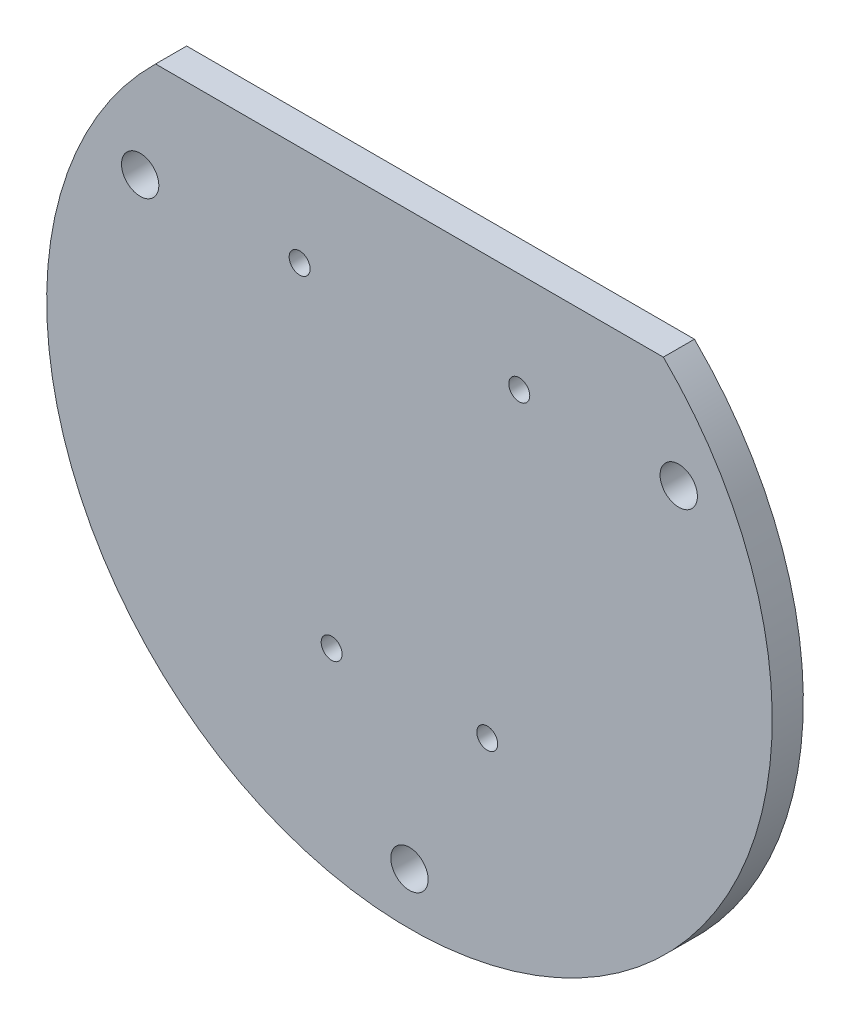
ISO-10303-21;
HEADER;
FILE_DESCRIPTION(('STEP AP214'),'2;1');
FILE_NAME('part.step','',(''),(''),'','','');
FILE_SCHEMA(('AUTOMOTIVE_DESIGN { 1 0 10303 214 1 1 1 1 }'));
ENDSEC;
DATA;
#1=APPLICATION_CONTEXT('core data for automotive mechanical design processes');
#2=APPLICATION_PROTOCOL_DEFINITION('international standard','automotive_design',2000,#1);
#3=PRODUCT_CONTEXT('',#1,'mechanical');
#4=PRODUCT('Part','Part','',(#3));
#5=PRODUCT_RELATED_PRODUCT_CATEGORY('part','',(#4));
#6=PRODUCT_DEFINITION_FORMATION('','',#4);
#7=PRODUCT_DEFINITION_CONTEXT('part definition',#1,'design');
#8=PRODUCT_DEFINITION('design','',#6,#7);
#9=PRODUCT_DEFINITION_SHAPE('','',#8);
#10=(LENGTH_UNIT() NAMED_UNIT(*) SI_UNIT(.MILLI.,.METRE.));
#11=(NAMED_UNIT(*) PLANE_ANGLE_UNIT() SI_UNIT($,.RADIAN.));
#12=(NAMED_UNIT(*) SI_UNIT($,.STERADIAN.) SOLID_ANGLE_UNIT());
#13=UNCERTAINTY_MEASURE_WITH_UNIT(LENGTH_MEASURE(1.E-05),#10,'distance_accuracy_value','');
#14=(GEOMETRIC_REPRESENTATION_CONTEXT(3) GLOBAL_UNCERTAINTY_ASSIGNED_CONTEXT((#13)) GLOBAL_UNIT_ASSIGNED_CONTEXT((#10,
#11,#12)) REPRESENTATION_CONTEXT('',''));
#15=CARTESIAN_POINT('',(0.,0.,0.));
#16=DIRECTION('',(0.,0.,1.));
#17=DIRECTION('',(1.,0.,0.));
#18=AXIS2_PLACEMENT_3D('',#15,#16,#17);
#19=CARTESIAN_POINT('',(0.,74.8590256141216,0.));
#20=DIRECTION('',(0.,0.,1.));
#21=DIRECTION('',(1.,0.,0.));
#22=AXIS2_PLACEMENT_3D('',#19,#20,#21);
#23=PLANE('',#22);
#24=CARTESIAN_POINT('',(0.,-73.3734122634726,0.));
#25=DIRECTION('',(0.,0.,1.));
#26=DIRECTION('',(1.,0.,0.));
#27=AXIS2_PLACEMENT_3D('',#24,#25,#26);
#28=CIRCLE('',#27,9.);
#29=CARTESIAN_POINT('',(-9.,-73.3734122634726,0.));
#30=VERTEX_POINT('',#29);
#31=EDGE_CURVE('E136',#30,#30,#28,.T.);
#32=ORIENTED_EDGE('',*,*,#31,.T.);
#33=EDGE_LOOP('',(#32));
#34=FACE_BOUND('',#33,.T.);
#35=CARTESIAN_POINT('',(129.903810567666,151.626587736527,0.));
#36=DIRECTION('',(0.,0.,1.));
#37=DIRECTION('',(-0.5,0.866025403784439,0.));
#38=AXIS2_PLACEMENT_3D('',#35,#36,#37);
#39=CIRCLE('',#38,9.);
#40=CARTESIAN_POINT('',(134.403810567666,143.832359102467,0.));
#41=VERTEX_POINT('',#40);
#42=EDGE_CURVE('E177',#41,#41,#39,.T.);
#43=ORIENTED_EDGE('',*,*,#42,.T.);
#44=EDGE_LOOP('',(#43));
#45=FACE_BOUND('',#44,.T.);
#46=CARTESIAN_POINT('',(-129.903810567666,151.626587736527,0.));
#47=DIRECTION('',(0.,0.,1.));
#48=DIRECTION('',(-0.5,-0.866025403784439,0.));
#49=AXIS2_PLACEMENT_3D('',#46,#47,#48);
#50=CIRCLE('',#49,9.);
#51=CARTESIAN_POINT('',(-125.403810567666,159.420816370587,0.));
#52=VERTEX_POINT('',#51);
#53=EDGE_CURVE('E135',#52,#52,#50,.T.);
#54=ORIENTED_EDGE('',*,*,#53,.T.);
#55=EDGE_LOOP('',(#54));
#56=FACE_BOUND('',#55,.T.);
#57=CARTESIAN_POINT('',(37.5349950094086,-3.77475828372553E-13,0.));
#58=DIRECTION('',(0.,0.,1.));
#59=DIRECTION('',(-1.,0.,0.));
#60=AXIS2_PLACEMENT_3D('',#57,#58,#59);
#61=CIRCLE('',#60,5.053);
#62=CARTESIAN_POINT('',(42.5879950094086,-3.78094642400162E-13,0.));
#63=VERTEX_POINT('',#62);
#64=EDGE_CURVE('E110',#63,#63,#61,.T.);
#65=ORIENTED_EDGE('',*,*,#64,.T.);
#66=EDGE_LOOP('',(#65));
#67=FACE_BOUND('',#66,.T.);
#68=CARTESIAN_POINT('',(-52.97728135,153.253175473055,0.));
#69=DIRECTION('',(0.,0.,1.));
#70=DIRECTION('',(-1.,0.,0.));
#71=AXIS2_PLACEMENT_3D('',#68,#69,#70);
#72=CIRCLE('',#71,5.053);
#73=CARTESIAN_POINT('',(-47.92428135,153.253175473055,0.));
#74=VERTEX_POINT('',#73);
#75=EDGE_CURVE('E159',#74,#74,#72,.T.);
#76=ORIENTED_EDGE('',*,*,#75,.T.);
#77=EDGE_LOOP('',(#76));
#78=FACE_BOUND('',#77,.T.);
#79=CARTESIAN_POINT('',(52.97728135,153.253175473055,0.));
#80=DIRECTION('',(0.,0.,1.));
#81=DIRECTION('',(-1.,0.,0.));
#82=AXIS2_PLACEMENT_3D('',#79,#80,#81);
#83=CIRCLE('',#82,5.053);
#84=CARTESIAN_POINT('',(58.03028135,153.253175473055,0.));
#85=VERTEX_POINT('',#84);
#86=EDGE_CURVE('E141',#85,#85,#83,.T.);
#87=ORIENTED_EDGE('',*,*,#86,.T.);
#88=EDGE_LOOP('',(#87));
#89=FACE_BOUND('',#88,.T.);
#90=CARTESIAN_POINT('',(-37.5349950094086,-3.86912724081867E-13,0.));
#91=DIRECTION('',(0.,0.,1.));
#92=DIRECTION('',(-1.,0.,0.));
#93=AXIS2_PLACEMENT_3D('',#90,#91,#92);
#94=CIRCLE('',#93,5.053);
#95=CARTESIAN_POINT('',(-32.4819950094086,-3.87531538109476E-13,0.));
#96=VERTEX_POINT('',#95);
#97=EDGE_CURVE('E202',#96,#96,#94,.T.);
#98=ORIENTED_EDGE('',*,*,#97,.T.);
#99=EDGE_LOOP('',(#98));
#100=FACE_BOUND('',#99,.T.);
#101=CARTESIAN_POINT('',(0.,76.6265877365274,0.));
#102=DIRECTION('',(0.,0.,1.));
#103=DIRECTION('',(-0.699854212223765,0.714285714285715,0.));
#104=AXIS2_PLACEMENT_3D('',#101,#102,#103);
#105=CIRCLE('',#104,175.);
#106=CARTESIAN_POINT('',(-122.474487139159,201.626587736527,0.));
#107=VERTEX_POINT('',#106);
#108=CARTESIAN_POINT('',(122.474487139159,201.626587736527,0.));
#109=VERTEX_POINT('',#108);
#110=EDGE_CURVE('E28',#107,#109,#105,.T.);
#111=ORIENTED_EDGE('',*,*,#110,.F.);
#112=DIRECTION('',(-1.,0.,0.));
#113=VECTOR('',#112,1.);
#114=CARTESIAN_POINT('',(122.474487139159,201.626587736527,0.));
#115=LINE('',#114,#113);
#116=EDGE_CURVE('E139',#109,#107,#115,.T.);
#117=ORIENTED_EDGE('',*,*,#116,.F.);
#118=EDGE_LOOP('',(#111,#117));
#119=FACE_BOUND('',#118,.T.);
#120=ADVANCED_FACE('F17',(#34,#45,#56,#67,#78,#89,#100,#119),#23,.F.);
#121=CARTESIAN_POINT('',(0.,74.8590256141216,15.));
#122=DIRECTION('',(0.,0.,1.));
#123=DIRECTION('',(1.,0.,0.));
#124=AXIS2_PLACEMENT_3D('',#121,#122,#123);
#125=PLANE('',#124);
#126=CARTESIAN_POINT('',(0.,-73.3734122634726,15.));
#127=DIRECTION('',(0.,0.,-1.));
#128=DIRECTION('',(1.,0.,0.));
#129=AXIS2_PLACEMENT_3D('',#126,#127,#128);
#130=CIRCLE('',#129,9.);
#131=CARTESIAN_POINT('',(-9.,-73.3734122634726,15.));
#132=VERTEX_POINT('',#131);
#133=EDGE_CURVE('E180',#132,#132,#130,.T.);
#134=ORIENTED_EDGE('',*,*,#133,.T.);
#135=EDGE_LOOP('',(#134));
#136=FACE_BOUND('',#135,.T.);
#137=CARTESIAN_POINT('',(129.903810567666,151.626587736527,15.));
#138=DIRECTION('',(0.,0.,-1.));
#139=DIRECTION('',(-0.5,0.866025403784439,0.));
#140=AXIS2_PLACEMENT_3D('',#137,#138,#139);
#141=CIRCLE('',#140,9.);
#142=CARTESIAN_POINT('',(134.403810567666,143.832359102467,15.));
#143=VERTEX_POINT('',#142);
#144=EDGE_CURVE('E130',#143,#143,#141,.T.);
#145=ORIENTED_EDGE('',*,*,#144,.T.);
#146=EDGE_LOOP('',(#145));
#147=FACE_BOUND('',#146,.T.);
#148=CARTESIAN_POINT('',(-129.903810567666,151.626587736527,15.));
#149=DIRECTION('',(0.,0.,-1.));
#150=DIRECTION('',(-0.5,-0.866025403784439,0.));
#151=AXIS2_PLACEMENT_3D('',#148,#149,#150);
#152=CIRCLE('',#151,9.);
#153=CARTESIAN_POINT('',(-125.403810567666,159.420816370587,15.));
#154=VERTEX_POINT('',#153);
#155=EDGE_CURVE('E181',#154,#154,#152,.T.);
#156=ORIENTED_EDGE('',*,*,#155,.T.);
#157=EDGE_LOOP('',(#156));
#158=FACE_BOUND('',#157,.T.);
#159=CARTESIAN_POINT('',(37.5349950094086,-3.77475828372553E-13,15.));
#160=DIRECTION('',(0.,0.,-1.));
#161=DIRECTION('',(-1.,0.,0.));
#162=AXIS2_PLACEMENT_3D('',#159,#160,#161);
#163=CIRCLE('',#162,5.053);
#164=CARTESIAN_POINT('',(42.5879950094086,-3.78094642400162E-13,15.));
#165=VERTEX_POINT('',#164);
#166=EDGE_CURVE('E111',#165,#165,#163,.T.);
#167=ORIENTED_EDGE('',*,*,#166,.T.);
#168=EDGE_LOOP('',(#167));
#169=FACE_BOUND('',#168,.T.);
#170=CARTESIAN_POINT('',(-52.97728135,153.253175473055,15.));
#171=DIRECTION('',(0.,0.,-1.));
#172=DIRECTION('',(-1.,0.,0.));
#173=AXIS2_PLACEMENT_3D('',#170,#171,#172);
#174=CIRCLE('',#173,5.053);
#175=CARTESIAN_POINT('',(-47.92428135,153.253175473055,15.));
#176=VERTEX_POINT('',#175);
#177=EDGE_CURVE('E117',#176,#176,#174,.T.);
#178=ORIENTED_EDGE('',*,*,#177,.T.);
#179=EDGE_LOOP('',(#178));
#180=FACE_BOUND('',#179,.T.);
#181=CARTESIAN_POINT('',(52.97728135,153.253175473055,15.));
#182=DIRECTION('',(0.,0.,-1.));
#183=DIRECTION('',(-1.,0.,0.));
#184=AXIS2_PLACEMENT_3D('',#181,#182,#183);
#185=CIRCLE('',#184,5.053);
#186=CARTESIAN_POINT('',(58.03028135,153.253175473055,15.));
#187=VERTEX_POINT('',#186);
#188=EDGE_CURVE('E150',#187,#187,#185,.T.);
#189=ORIENTED_EDGE('',*,*,#188,.T.);
#190=EDGE_LOOP('',(#189));
#191=FACE_BOUND('',#190,.T.);
#192=CARTESIAN_POINT('',(-37.5349950094086,-3.86912724081867E-13,15.));
#193=DIRECTION('',(0.,0.,-1.));
#194=DIRECTION('',(-1.,0.,0.));
#195=AXIS2_PLACEMENT_3D('',#192,#193,#194);
#196=CIRCLE('',#195,5.053);
#197=CARTESIAN_POINT('',(-32.4819950094086,-3.87531538109476E-13,15.));
#198=VERTEX_POINT('',#197);
#199=EDGE_CURVE('E146',#198,#198,#196,.T.);
#200=ORIENTED_EDGE('',*,*,#199,.T.);
#201=EDGE_LOOP('',(#200));
#202=FACE_BOUND('',#201,.T.);
#203=CARTESIAN_POINT('',(0.,76.6265877365274,15.));
#204=DIRECTION('',(0.,0.,1.));
#205=DIRECTION('',(-0.699854212223765,0.714285714285715,0.));
#206=AXIS2_PLACEMENT_3D('',#203,#204,#205);
#207=CIRCLE('',#206,175.);
#208=CARTESIAN_POINT('',(-122.474487139159,201.626587736527,15.));
#209=VERTEX_POINT('',#208);
#210=CARTESIAN_POINT('',(122.474487139159,201.626587736527,15.));
#211=VERTEX_POINT('',#210);
#212=EDGE_CURVE('E11',#209,#211,#207,.T.);
#213=ORIENTED_EDGE('',*,*,#212,.T.);
#214=DIRECTION('',(-1.,0.,0.));
#215=VECTOR('',#214,1.);
#216=CARTESIAN_POINT('',(122.474487139159,201.626587736527,15.));
#217=LINE('',#216,#215);
#218=EDGE_CURVE('E126',#211,#209,#217,.T.);
#219=ORIENTED_EDGE('',*,*,#218,.T.);
#220=EDGE_LOOP('',(#213,#219));
#221=FACE_BOUND('',#220,.T.);
#222=ADVANCED_FACE('F216',(#136,#147,#158,#169,#180,#191,#202,#221),#125,.T.);
#223=CARTESIAN_POINT('',(0.,76.6265877365274,0.));
#224=DIRECTION('',(0.,0.,1.));
#225=DIRECTION('',(0.,-1.,0.));
#226=AXIS2_PLACEMENT_3D('',#223,#224,#225);
#227=CYLINDRICAL_SURFACE('',#226,175.);
#228=ORIENTED_EDGE('',*,*,#110,.T.);
#229=DIRECTION('',(0.,0.,1.));
#230=VECTOR('',#229,1.);
#231=CARTESIAN_POINT('',(122.474487139159,201.626587736527,0.));
#232=LINE('',#231,#230);
#233=EDGE_CURVE('E129',#109,#211,#232,.T.);
#234=ORIENTED_EDGE('',*,*,#233,.T.);
#235=ORIENTED_EDGE('',*,*,#212,.F.);
#236=DIRECTION('',(0.,0.,1.));
#237=VECTOR('',#236,1.);
#238=CARTESIAN_POINT('',(-122.474487139159,201.626587736527,0.));
#239=LINE('',#238,#237);
#240=EDGE_CURVE('E21',#107,#209,#239,.T.);
#241=ORIENTED_EDGE('',*,*,#240,.F.);
#242=EDGE_LOOP('',(#228,#234,#235,#241));
#243=FACE_BOUND('',#242,.T.);
#244=ADVANCED_FACE('F218',(#243),#227,.T.);
#245=CARTESIAN_POINT('',(122.474487139159,201.626587736527,0.));
#246=DIRECTION('',(0.,1.,0.));
#247=DIRECTION('',(1.,0.,0.));
#248=AXIS2_PLACEMENT_3D('',#245,#246,#247);
#249=PLANE('',#248);
#250=ORIENTED_EDGE('',*,*,#116,.T.);
#251=ORIENTED_EDGE('',*,*,#240,.T.);
#252=ORIENTED_EDGE('',*,*,#218,.F.);
#253=ORIENTED_EDGE('',*,*,#233,.F.);
#254=EDGE_LOOP('',(#250,#251,#252,#253));
#255=FACE_BOUND('',#254,.T.);
#256=ADVANCED_FACE('F226',(#255),#249,.T.);
#257=CARTESIAN_POINT('',(0.,-73.3734122634726,-446.221205063254));
#258=DIRECTION('',(0.,0.,1.));
#259=DIRECTION('',(1.,0.,0.));
#260=AXIS2_PLACEMENT_3D('',#257,#258,#259);
#261=CYLINDRICAL_SURFACE('',#260,9.);
#262=ORIENTED_EDGE('',*,*,#133,.F.);
#263=DIRECTION('',(0.,0.,-1.));
#264=VECTOR('',#263,1.);
#265=CARTESIAN_POINT('',(-9.,-73.3734122634726,-446.221205063254));
#266=LINE('',#265,#264);
#267=EDGE_CURVE('E140',#132,#30,#266,.T.);
#268=ORIENTED_EDGE('',*,*,#267,.T.);
#269=ORIENTED_EDGE('',*,*,#31,.F.);
#270=ORIENTED_EDGE('',*,*,#267,.F.);
#271=EDGE_LOOP('',(#262,#268,#269,#270));
#272=FACE_BOUND('',#271,.T.);
#273=ADVANCED_FACE('F250',(#272),#261,.F.);
#274=CARTESIAN_POINT('',(129.903810567666,151.626587736527,-446.221205063254));
#275=DIRECTION('',(0.,0.,1.));
#276=DIRECTION('',(-0.5,0.866025403784439,0.));
#277=AXIS2_PLACEMENT_3D('',#274,#275,#276);
#278=CYLINDRICAL_SURFACE('',#277,9.);
#279=ORIENTED_EDGE('',*,*,#144,.F.);
#280=DIRECTION('',(0.,0.,-1.));
#281=VECTOR('',#280,1.);
#282=CARTESIAN_POINT('',(134.403810567666,143.832359102467,-446.221205063254));
#283=LINE('',#282,#281);
#284=EDGE_CURVE('E134',#143,#41,#283,.T.);
#285=ORIENTED_EDGE('',*,*,#284,.T.);
#286=ORIENTED_EDGE('',*,*,#42,.F.);
#287=ORIENTED_EDGE('',*,*,#284,.F.);
#288=EDGE_LOOP('',(#279,#285,#286,#287));
#289=FACE_BOUND('',#288,.T.);
#290=ADVANCED_FACE('F245',(#289),#278,.F.);
#291=CARTESIAN_POINT('',(-129.903810567666,151.626587736527,-446.221205063254));
#292=DIRECTION('',(0.,0.,1.));
#293=DIRECTION('',(-0.5,-0.866025403784439,0.));
#294=AXIS2_PLACEMENT_3D('',#291,#292,#293);
#295=CYLINDRICAL_SURFACE('',#294,9.);
#296=ORIENTED_EDGE('',*,*,#155,.F.);
#297=DIRECTION('',(0.,0.,-1.));
#298=VECTOR('',#297,1.);
#299=CARTESIAN_POINT('',(-125.403810567666,159.420816370587,-446.221205063254));
#300=LINE('',#299,#298);
#301=EDGE_CURVE('E156',#154,#52,#300,.T.);
#302=ORIENTED_EDGE('',*,*,#301,.T.);
#303=ORIENTED_EDGE('',*,*,#53,.F.);
#304=ORIENTED_EDGE('',*,*,#301,.F.);
#305=EDGE_LOOP('',(#296,#302,#303,#304));
#306=FACE_BOUND('',#305,.T.);
#307=ADVANCED_FACE('F19',(#306),#295,.F.);
#308=CARTESIAN_POINT('',(37.5349950094086,-3.77475828372553E-13,461.221205063254));
#309=DIRECTION('',(0.,0.,-1.));
#310=DIRECTION('',(-1.,0.,0.));
#311=AXIS2_PLACEMENT_3D('',#308,#309,#310);
#312=CYLINDRICAL_SURFACE('',#311,5.053);
#313=ORIENTED_EDGE('',*,*,#64,.F.);
#314=DIRECTION('',(0.,0.,1.));
#315=VECTOR('',#314,1.);
#316=CARTESIAN_POINT('',(42.5879950094086,-3.78094642400162E-13,461.221205063254));
#317=LINE('',#316,#315);
#318=EDGE_CURVE('E107',#63,#165,#317,.T.);
#319=ORIENTED_EDGE('',*,*,#318,.T.);
#320=ORIENTED_EDGE('',*,*,#166,.F.);
#321=ORIENTED_EDGE('',*,*,#318,.F.);
#322=EDGE_LOOP('',(#313,#319,#320,#321));
#323=FACE_BOUND('',#322,.T.);
#324=ADVANCED_FACE('F109',(#323),#312,.F.);
#325=CARTESIAN_POINT('',(-52.97728135,153.253175473055,461.221205063254));
#326=DIRECTION('',(0.,0.,-1.));
#327=DIRECTION('',(-1.,0.,0.));
#328=AXIS2_PLACEMENT_3D('',#325,#326,#327);
#329=CYLINDRICAL_SURFACE('',#328,5.053);
#330=ORIENTED_EDGE('',*,*,#75,.F.);
#331=DIRECTION('',(0.,0.,1.));
#332=VECTOR('',#331,1.);
#333=CARTESIAN_POINT('',(-47.92428135,153.253175473055,461.221205063254));
#334=LINE('',#333,#332);
#335=EDGE_CURVE('E123',#74,#176,#334,.T.);
#336=ORIENTED_EDGE('',*,*,#335,.T.);
#337=ORIENTED_EDGE('',*,*,#177,.F.);
#338=ORIENTED_EDGE('',*,*,#335,.F.);
#339=EDGE_LOOP('',(#330,#336,#337,#338));
#340=FACE_BOUND('',#339,.T.);
#341=ADVANCED_FACE('F232',(#340),#329,.F.);
#342=CARTESIAN_POINT('',(52.97728135,153.253175473055,461.221205063254));
#343=DIRECTION('',(0.,0.,-1.));
#344=DIRECTION('',(-1.,0.,0.));
#345=AXIS2_PLACEMENT_3D('',#342,#343,#344);
#346=CYLINDRICAL_SURFACE('',#345,5.053);
#347=ORIENTED_EDGE('',*,*,#86,.F.);
#348=DIRECTION('',(0.,0.,1.));
#349=VECTOR('',#348,1.);
#350=CARTESIAN_POINT('',(58.03028135,153.253175473055,461.221205063254));
#351=LINE('',#350,#349);
#352=EDGE_CURVE('E145',#85,#187,#351,.T.);
#353=ORIENTED_EDGE('',*,*,#352,.T.);
#354=ORIENTED_EDGE('',*,*,#188,.F.);
#355=ORIENTED_EDGE('',*,*,#352,.F.);
#356=EDGE_LOOP('',(#347,#353,#354,#355));
#357=FACE_BOUND('',#356,.T.);
#358=ADVANCED_FACE('F235',(#357),#346,.F.);
#359=CARTESIAN_POINT('',(-37.5349950094086,-3.86912724081867E-13,461.221205063254));
#360=DIRECTION('',(0.,0.,-1.));
#361=DIRECTION('',(-1.,0.,0.));
#362=AXIS2_PLACEMENT_3D('',#359,#360,#361);
#363=CYLINDRICAL_SURFACE('',#362,5.053);
#364=ORIENTED_EDGE('',*,*,#97,.F.);
#365=DIRECTION('',(0.,0.,1.));
#366=VECTOR('',#365,1.);
#367=CARTESIAN_POINT('',(-32.4819950094086,-3.87531538109476E-13,461.221205063254));
#368=LINE('',#367,#366);
#369=EDGE_CURVE('E158',#96,#198,#368,.T.);
#370=ORIENTED_EDGE('',*,*,#369,.T.);
#371=ORIENTED_EDGE('',*,*,#199,.F.);
#372=ORIENTED_EDGE('',*,*,#369,.F.);
#373=EDGE_LOOP('',(#364,#370,#371,#372));
#374=FACE_BOUND('',#373,.T.);
#375=ADVANCED_FACE('F214',(#374),#363,.F.);
#376=CLOSED_SHELL('',(#120,#222,#244,#256,#273,#290,#307,#324,#341,#358,#375));
#377=MANIFOLD_SOLID_BREP('B1',#376);
#378=ADVANCED_BREP_SHAPE_REPRESENTATION('',(#18,#377),#14);
#379=SHAPE_DEFINITION_REPRESENTATION(#9,#378);
ENDSEC;
END-ISO-10303-21;
